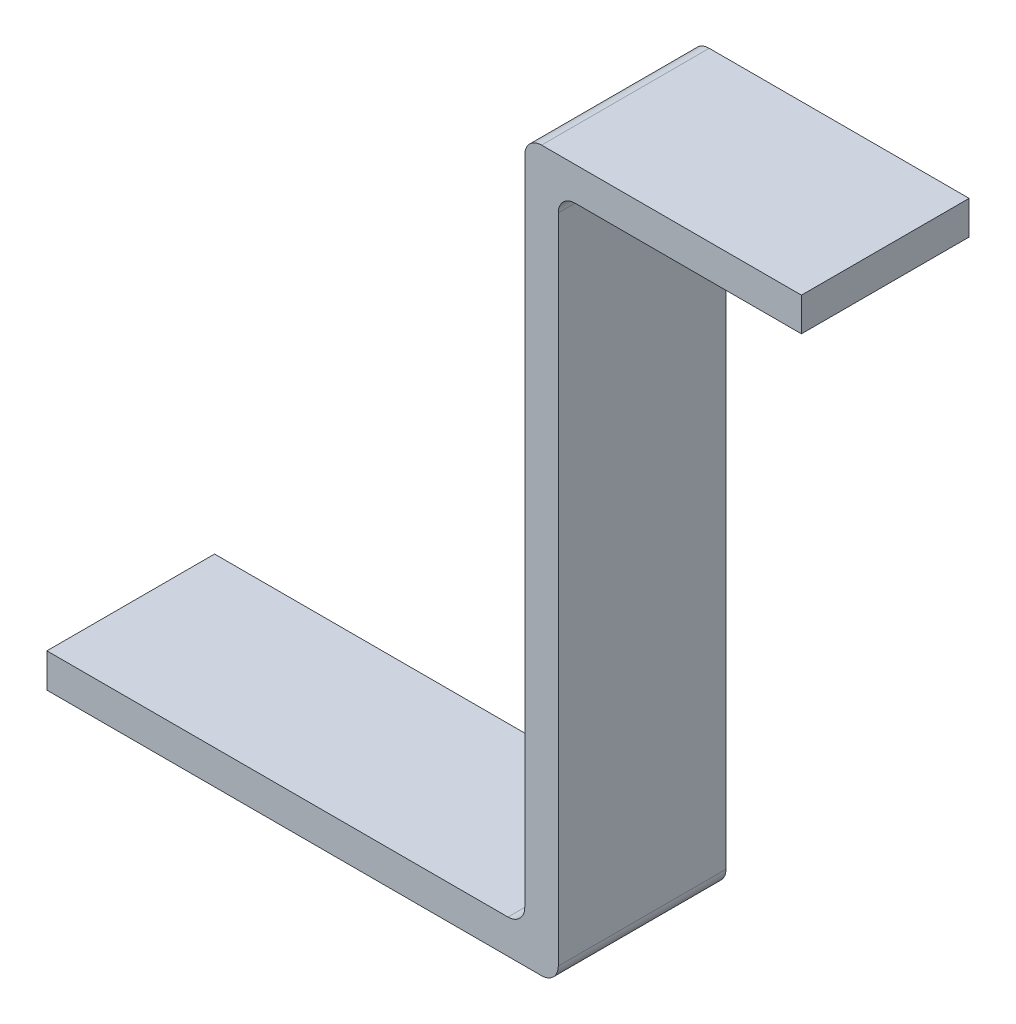
ISO-10303-21;
HEADER;
FILE_DESCRIPTION(('STEP AP214'),'2;1');
FILE_NAME('part.step','',(''),(''),'','','');
FILE_SCHEMA(('AUTOMOTIVE_DESIGN { 1 0 10303 214 1 1 1 1 }'));
ENDSEC;
DATA;
#1=APPLICATION_CONTEXT('core data for automotive mechanical design processes');
#2=APPLICATION_PROTOCOL_DEFINITION('international standard','automotive_design',2000,#1);
#3=PRODUCT_CONTEXT('',#1,'mechanical');
#4=PRODUCT('Part','Part','',(#3));
#5=PRODUCT_RELATED_PRODUCT_CATEGORY('part','',(#4));
#6=PRODUCT_DEFINITION_FORMATION('','',#4);
#7=PRODUCT_DEFINITION_CONTEXT('part definition',#1,'design');
#8=PRODUCT_DEFINITION('design','',#6,#7);
#9=PRODUCT_DEFINITION_SHAPE('','',#8);
#10=(LENGTH_UNIT() NAMED_UNIT(*) SI_UNIT(.MILLI.,.METRE.));
#11=(NAMED_UNIT(*) PLANE_ANGLE_UNIT() SI_UNIT($,.RADIAN.));
#12=(NAMED_UNIT(*) SI_UNIT($,.STERADIAN.) SOLID_ANGLE_UNIT());
#13=UNCERTAINTY_MEASURE_WITH_UNIT(LENGTH_MEASURE(1.E-05),#10,'distance_accuracy_value','');
#14=(GEOMETRIC_REPRESENTATION_CONTEXT(3) GLOBAL_UNCERTAINTY_ASSIGNED_CONTEXT((#13)) GLOBAL_UNIT_ASSIGNED_CONTEXT((#10,
#11,#12)) REPRESENTATION_CONTEXT('',''));
#15=CARTESIAN_POINT('',(0.,0.,0.));
#16=DIRECTION('',(0.,0.,1.));
#17=DIRECTION('',(1.,0.,0.));
#18=AXIS2_PLACEMENT_3D('',#15,#16,#17);
#19=CARTESIAN_POINT('',(0.,0.,25.4));
#20=DIRECTION('',(0.,0.,-1.));
#21=DIRECTION('',(-1.,0.,0.));
#22=AXIS2_PLACEMENT_3D('',#19,#20,#21);
#23=PLANE('',#22);
#24=CARTESIAN_POINT('',(17.78,73.66,25.4));
#25=DIRECTION('',(0.,0.,1.));
#26=DIRECTION('',(1.,0.,0.));
#27=AXIS2_PLACEMENT_3D('',#24,#25,#26);
#28=CIRCLE('',#27,2.54);
#29=CARTESIAN_POINT('',(17.78,76.2,25.4));
#30=VERTEX_POINT('',#29);
#31=CARTESIAN_POINT('',(15.24,73.66,25.4));
#32=VERTEX_POINT('',#31);
#33=EDGE_CURVE('E93',#30,#32,#28,.T.);
#34=ORIENTED_EDGE('',*,*,#33,.T.);
#35=DIRECTION('',(0.,1.,0.));
#36=VECTOR('',#35,1.);
#37=CARTESIAN_POINT('',(15.24,0.,25.4));
#38=LINE('',#37,#36);
#39=CARTESIAN_POINT('',(15.24,-25.0698,25.4));
#40=VERTEX_POINT('',#39);
#41=EDGE_CURVE('E186',#40,#32,#38,.T.);
#42=ORIENTED_EDGE('',*,*,#41,.F.);
#43=CARTESIAN_POINT('',(12.7,-25.0698,25.4));
#44=DIRECTION('',(0.,0.,1.));
#45=DIRECTION('',(1.,0.,0.));
#46=AXIS2_PLACEMENT_3D('',#43,#44,#45);
#47=CIRCLE('',#46,2.54);
#48=CARTESIAN_POINT('',(12.7,-27.6098,25.4));
#49=VERTEX_POINT('',#48);
#50=EDGE_CURVE('E248',#49,#40,#47,.T.);
#51=ORIENTED_EDGE('',*,*,#50,.F.);
#52=DIRECTION('',(1.,0.,0.));
#53=VECTOR('',#52,1.);
#54=CARTESIAN_POINT('',(0.,-27.6098,25.4));
#55=LINE('',#54,#53);
#56=CARTESIAN_POINT('',(-57.15,-27.6098,25.4));
#57=VERTEX_POINT('',#56);
#58=EDGE_CURVE('E251',#57,#49,#55,.T.);
#59=ORIENTED_EDGE('',*,*,#58,.F.);
#60=DIRECTION('',(0.,-1.,0.));
#61=VECTOR('',#60,1.);
#62=CARTESIAN_POINT('',(-57.15,76.2,25.4));
#63=LINE('',#62,#61);
#64=CARTESIAN_POINT('',(-57.15,-32.766,25.4));
#65=VERTEX_POINT('',#64);
#66=EDGE_CURVE('E190',#57,#65,#63,.T.);
#67=ORIENTED_EDGE('',*,*,#66,.T.);
#68=DIRECTION('',(-1.,0.,0.));
#69=VECTOR('',#68,1.);
#70=CARTESIAN_POINT('',(0.,-32.766,25.4));
#71=LINE('',#70,#69);
#72=CARTESIAN_POINT('',(17.78,-32.766,25.4));
#73=VERTEX_POINT('',#72);
#74=EDGE_CURVE('E218',#73,#65,#71,.T.);
#75=ORIENTED_EDGE('',*,*,#74,.F.);
#76=CARTESIAN_POINT('',(17.78,-30.226,25.4));
#77=DIRECTION('',(0.,0.,1.));
#78=DIRECTION('',(1.,0.,0.));
#79=AXIS2_PLACEMENT_3D('',#76,#77,#78);
#80=CIRCLE('',#79,2.54);
#81=CARTESIAN_POINT('',(20.32,-30.226,25.4));
#82=VERTEX_POINT('',#81);
#83=EDGE_CURVE('E221',#73,#82,#80,.T.);
#84=ORIENTED_EDGE('',*,*,#83,.T.);
#85=DIRECTION('',(0.,-1.,0.));
#86=VECTOR('',#85,1.);
#87=CARTESIAN_POINT('',(20.32,0.,25.4));
#88=LINE('',#87,#86);
#89=CARTESIAN_POINT('',(20.32,68.58,25.4));
#90=VERTEX_POINT('',#89);
#91=EDGE_CURVE('E224',#90,#82,#88,.T.);
#92=ORIENTED_EDGE('',*,*,#91,.F.);
#93=CARTESIAN_POINT('',(22.86,68.58,25.4));
#94=DIRECTION('',(0.,0.,1.));
#95=DIRECTION('',(1.,0.,0.));
#96=AXIS2_PLACEMENT_3D('',#93,#94,#95);
#97=CIRCLE('',#96,2.54);
#98=CARTESIAN_POINT('',(22.86,71.12,25.4));
#99=VERTEX_POINT('',#98);
#100=EDGE_CURVE('E226',#90,#99,#97,.F.);
#101=ORIENTED_EDGE('',*,*,#100,.T.);
#102=DIRECTION('',(1.,0.,0.));
#103=VECTOR('',#102,1.);
#104=CARTESIAN_POINT('',(0.,71.12,25.4));
#105=LINE('',#104,#103);
#106=CARTESIAN_POINT('',(57.15,71.12,25.4));
#107=VERTEX_POINT('',#106);
#108=EDGE_CURVE('E214',#99,#107,#105,.T.);
#109=ORIENTED_EDGE('',*,*,#108,.T.);
#110=DIRECTION('',(0.,1.,0.));
#111=VECTOR('',#110,1.);
#112=CARTESIAN_POINT('',(57.15,76.2,25.4));
#113=LINE('',#112,#111);
#114=CARTESIAN_POINT('',(57.15,76.2,25.4));
#115=VERTEX_POINT('',#114);
#116=EDGE_CURVE('E192',#107,#115,#113,.T.);
#117=ORIENTED_EDGE('',*,*,#116,.T.);
#118=DIRECTION('',(-1.,0.,0.));
#119=VECTOR('',#118,1.);
#120=CARTESIAN_POINT('',(57.15,76.2,25.4));
#121=LINE('',#120,#119);
#122=EDGE_CURVE('E86',#115,#30,#121,.T.);
#123=ORIENTED_EDGE('',*,*,#122,.T.);
#124=EDGE_LOOP('',(#34,#42,#51,#59,#67,#75,#84,#92,#101,#109,#117,#123));
#125=FACE_BOUND('',#124,.T.);
#126=ADVANCED_FACE('F78',(#125),#23,.F.);
#127=CARTESIAN_POINT('',(0.,0.,0.));
#128=DIRECTION('',(0.,0.,-1.));
#129=DIRECTION('',(-1.,0.,0.));
#130=AXIS2_PLACEMENT_3D('',#127,#128,#129);
#131=PLANE('',#130);
#132=DIRECTION('',(0.,1.,0.));
#133=VECTOR('',#132,1.);
#134=CARTESIAN_POINT('',(15.24,0.,0.));
#135=LINE('',#134,#133);
#136=CARTESIAN_POINT('',(15.24,-25.0698,0.));
#137=VERTEX_POINT('',#136);
#138=CARTESIAN_POINT('',(15.24,73.66,0.));
#139=VERTEX_POINT('',#138);
#140=EDGE_CURVE('E175',#137,#139,#135,.T.);
#141=ORIENTED_EDGE('',*,*,#140,.T.);
#142=CARTESIAN_POINT('',(17.78,73.66,0.));
#143=DIRECTION('',(0.,0.,1.));
#144=DIRECTION('',(1.,0.,0.));
#145=AXIS2_PLACEMENT_3D('',#142,#143,#144);
#146=CIRCLE('',#145,2.54);
#147=CARTESIAN_POINT('',(17.78,76.2,0.));
#148=VERTEX_POINT('',#147);
#149=EDGE_CURVE('E168',#148,#139,#146,.T.);
#150=ORIENTED_EDGE('',*,*,#149,.F.);
#151=DIRECTION('',(-1.,0.,0.));
#152=VECTOR('',#151,1.);
#153=CARTESIAN_POINT('',(57.15,76.2,0.));
#154=LINE('',#153,#152);
#155=CARTESIAN_POINT('',(57.15,76.2,0.));
#156=VERTEX_POINT('',#155);
#157=EDGE_CURVE('E182',#156,#148,#154,.T.);
#158=ORIENTED_EDGE('',*,*,#157,.F.);
#159=DIRECTION('',(0.,1.,0.));
#160=VECTOR('',#159,1.);
#161=CARTESIAN_POINT('',(57.15,76.2,0.));
#162=LINE('',#161,#160);
#163=CARTESIAN_POINT('',(57.15,71.12,0.));
#164=VERTEX_POINT('',#163);
#165=EDGE_CURVE('E191',#164,#156,#162,.T.);
#166=ORIENTED_EDGE('',*,*,#165,.F.);
#167=DIRECTION('',(1.,0.,0.));
#168=VECTOR('',#167,1.);
#169=CARTESIAN_POINT('',(0.,71.12,0.));
#170=LINE('',#169,#168);
#171=CARTESIAN_POINT('',(22.86,71.12,0.));
#172=VERTEX_POINT('',#171);
#173=EDGE_CURVE('E203',#172,#164,#170,.T.);
#174=ORIENTED_EDGE('',*,*,#173,.F.);
#175=CARTESIAN_POINT('',(22.86,68.58,0.));
#176=DIRECTION('',(0.,0.,1.));
#177=DIRECTION('',(1.,0.,0.));
#178=AXIS2_PLACEMENT_3D('',#175,#176,#177);
#179=CIRCLE('',#178,2.54);
#180=CARTESIAN_POINT('',(20.32,68.58,0.));
#181=VERTEX_POINT('',#180);
#182=EDGE_CURVE('E217',#181,#172,#179,.F.);
#183=ORIENTED_EDGE('',*,*,#182,.F.);
#184=DIRECTION('',(0.,-1.,0.));
#185=VECTOR('',#184,1.);
#186=CARTESIAN_POINT('',(20.32,0.,0.));
#187=LINE('',#186,#185);
#188=CARTESIAN_POINT('',(20.32,-30.226,0.));
#189=VERTEX_POINT('',#188);
#190=EDGE_CURVE('E236',#181,#189,#187,.T.);
#191=ORIENTED_EDGE('',*,*,#190,.T.);
#192=CARTESIAN_POINT('',(17.78,-30.226,0.));
#193=DIRECTION('',(0.,0.,1.));
#194=DIRECTION('',(1.,0.,0.));
#195=AXIS2_PLACEMENT_3D('',#192,#193,#194);
#196=CIRCLE('',#195,2.54);
#197=CARTESIAN_POINT('',(17.78,-32.766,0.));
#198=VERTEX_POINT('',#197);
#199=EDGE_CURVE('E234',#198,#189,#196,.T.);
#200=ORIENTED_EDGE('',*,*,#199,.F.);
#201=DIRECTION('',(-1.,0.,0.));
#202=VECTOR('',#201,1.);
#203=CARTESIAN_POINT('',(0.,-32.766,0.));
#204=LINE('',#203,#202);
#205=CARTESIAN_POINT('',(-57.15,-32.766,0.));
#206=VERTEX_POINT('',#205);
#207=EDGE_CURVE('E231',#198,#206,#204,.T.);
#208=ORIENTED_EDGE('',*,*,#207,.T.);
#209=DIRECTION('',(0.,-1.,0.));
#210=VECTOR('',#209,1.);
#211=CARTESIAN_POINT('',(-57.15,76.2,0.));
#212=LINE('',#211,#210);
#213=CARTESIAN_POINT('',(-57.15,-27.6098,0.));
#214=VERTEX_POINT('',#213);
#215=EDGE_CURVE('E194',#214,#206,#212,.T.);
#216=ORIENTED_EDGE('',*,*,#215,.F.);
#217=DIRECTION('',(1.,0.,0.));
#218=VECTOR('',#217,1.);
#219=CARTESIAN_POINT('',(0.,-27.6098,0.));
#220=LINE('',#219,#218);
#221=CARTESIAN_POINT('',(12.7,-27.6098,0.));
#222=VERTEX_POINT('',#221);
#223=EDGE_CURVE('E185',#214,#222,#220,.T.);
#224=ORIENTED_EDGE('',*,*,#223,.T.);
#225=CARTESIAN_POINT('',(12.7,-25.0698,0.));
#226=DIRECTION('',(0.,0.,1.));
#227=DIRECTION('',(1.,0.,0.));
#228=AXIS2_PLACEMENT_3D('',#225,#226,#227);
#229=CIRCLE('',#228,2.54);
#230=EDGE_CURVE('E256',#222,#137,#229,.T.);
#231=ORIENTED_EDGE('',*,*,#230,.T.);
#232=EDGE_LOOP('',(#141,#150,#158,#166,#174,#183,#191,#200,#208,#216,#224,#231));
#233=FACE_BOUND('',#232,.T.);
#234=ADVANCED_FACE('F180',(#233),#131,.T.);
#235=CARTESIAN_POINT('',(57.15,76.2,25.4));
#236=DIRECTION('',(-1.,0.,0.));
#237=DIRECTION('',(0.,-1.,0.));
#238=AXIS2_PLACEMENT_3D('',#235,#236,#237);
#239=PLANE('',#238);
#240=DIRECTION('',(0.,0.,1.));
#241=VECTOR('',#240,1.);
#242=CARTESIAN_POINT('',(57.15,71.12,0.));
#243=LINE('',#242,#241);
#244=EDGE_CURVE('E210',#164,#107,#243,.T.);
#245=ORIENTED_EDGE('',*,*,#244,.F.);
#246=ORIENTED_EDGE('',*,*,#165,.T.);
#247=DIRECTION('',(0.,0.,-1.));
#248=VECTOR('',#247,1.);
#249=CARTESIAN_POINT('',(57.15,76.2,25.4));
#250=LINE('',#249,#248);
#251=EDGE_CURVE('E12',#115,#156,#250,.T.);
#252=ORIENTED_EDGE('',*,*,#251,.F.);
#253=ORIENTED_EDGE('',*,*,#116,.F.);
#254=EDGE_LOOP('',(#245,#246,#252,#253));
#255=FACE_BOUND('',#254,.T.);
#256=ADVANCED_FACE('F290',(#255),#239,.F.);
#257=CARTESIAN_POINT('',(-57.15,76.2,25.4));
#258=DIRECTION('',(1.,0.,0.));
#259=DIRECTION('',(0.,1.,0.));
#260=AXIS2_PLACEMENT_3D('',#257,#258,#259);
#261=PLANE('',#260);
#262=ORIENTED_EDGE('',*,*,#66,.F.);
#263=DIRECTION('',(0.,0.,1.));
#264=VECTOR('',#263,1.);
#265=CARTESIAN_POINT('',(-57.15,-27.6098,0.));
#266=LINE('',#265,#264);
#267=EDGE_CURVE('E174',#214,#57,#266,.T.);
#268=ORIENTED_EDGE('',*,*,#267,.F.);
#269=ORIENTED_EDGE('',*,*,#215,.T.);
#270=DIRECTION('',(0.,0.,1.));
#271=VECTOR('',#270,1.);
#272=CARTESIAN_POINT('',(-57.15,-32.766,0.));
#273=LINE('',#272,#271);
#274=EDGE_CURVE('E207',#206,#65,#273,.T.);
#275=ORIENTED_EDGE('',*,*,#274,.T.);
#276=EDGE_LOOP('',(#262,#268,#269,#275));
#277=FACE_BOUND('',#276,.T.);
#278=ADVANCED_FACE('F80',(#277),#261,.F.);
#279=CARTESIAN_POINT('',(57.15,76.2,25.4));
#280=DIRECTION('',(0.,-1.,0.));
#281=DIRECTION('',(0.,0.,-1.));
#282=AXIS2_PLACEMENT_3D('',#279,#280,#281);
#283=PLANE('',#282);
#284=ORIENTED_EDGE('',*,*,#157,.T.);
#285=DIRECTION('',(0.,0.,1.));
#286=VECTOR('',#285,1.);
#287=CARTESIAN_POINT('',(17.78,76.2,0.));
#288=LINE('',#287,#286);
#289=EDGE_CURVE('E165',#148,#30,#288,.T.);
#290=ORIENTED_EDGE('',*,*,#289,.T.);
#291=ORIENTED_EDGE('',*,*,#122,.F.);
#292=ORIENTED_EDGE('',*,*,#251,.T.);
#293=EDGE_LOOP('',(#284,#290,#291,#292));
#294=FACE_BOUND('',#293,.T.);
#295=ADVANCED_FACE('F188',(#294),#283,.F.);
#296=CARTESIAN_POINT('',(22.86,68.58,0.));
#297=DIRECTION('',(0.,0.,1.));
#298=DIRECTION('',(1.,0.,0.));
#299=AXIS2_PLACEMENT_3D('',#296,#297,#298);
#300=CYLINDRICAL_SURFACE('',#299,2.54);
#301=ORIENTED_EDGE('',*,*,#100,.F.);
#302=DIRECTION('',(0.,0.,1.));
#303=VECTOR('',#302,1.);
#304=CARTESIAN_POINT('',(20.32,68.58,0.));
#305=LINE('',#304,#303);
#306=EDGE_CURVE('E201',#181,#90,#305,.T.);
#307=ORIENTED_EDGE('',*,*,#306,.F.);
#308=ORIENTED_EDGE('',*,*,#182,.T.);
#309=DIRECTION('',(0.,0.,1.));
#310=VECTOR('',#309,1.);
#311=CARTESIAN_POINT('',(22.86,71.12,0.));
#312=LINE('',#311,#310);
#313=EDGE_CURVE('E198',#172,#99,#312,.T.);
#314=ORIENTED_EDGE('',*,*,#313,.T.);
#315=EDGE_LOOP('',(#301,#307,#308,#314));
#316=FACE_BOUND('',#315,.T.);
#317=ADVANCED_FACE('F283',(#316),#300,.F.);
#318=CARTESIAN_POINT('',(0.,71.12,0.));
#319=DIRECTION('',(0.,-1.,0.));
#320=DIRECTION('',(0.,0.,-1.));
#321=AXIS2_PLACEMENT_3D('',#318,#319,#320);
#322=PLANE('',#321);
#323=ORIENTED_EDGE('',*,*,#108,.F.);
#324=ORIENTED_EDGE('',*,*,#313,.F.);
#325=ORIENTED_EDGE('',*,*,#173,.T.);
#326=ORIENTED_EDGE('',*,*,#244,.T.);
#327=EDGE_LOOP('',(#323,#324,#325,#326));
#328=FACE_BOUND('',#327,.T.);
#329=ADVANCED_FACE('F287',(#328),#322,.T.);
#330=CARTESIAN_POINT('',(0.,-32.766,0.));
#331=DIRECTION('',(0.,1.,0.));
#332=DIRECTION('',(-1.,0.,0.));
#333=AXIS2_PLACEMENT_3D('',#330,#331,#332);
#334=PLANE('',#333);
#335=ORIENTED_EDGE('',*,*,#74,.T.);
#336=ORIENTED_EDGE('',*,*,#274,.F.);
#337=ORIENTED_EDGE('',*,*,#207,.F.);
#338=DIRECTION('',(0.,0.,1.));
#339=VECTOR('',#338,1.);
#340=CARTESIAN_POINT('',(17.78,-32.766,0.));
#341=LINE('',#340,#339);
#342=EDGE_CURVE('E205',#198,#73,#341,.T.);
#343=ORIENTED_EDGE('',*,*,#342,.T.);
#344=EDGE_LOOP('',(#335,#336,#337,#343));
#345=FACE_BOUND('',#344,.T.);
#346=ADVANCED_FACE('F272',(#345),#334,.F.);
#347=CARTESIAN_POINT('',(17.78,-30.226,0.));
#348=DIRECTION('',(0.,0.,1.));
#349=DIRECTION('',(1.,0.,0.));
#350=AXIS2_PLACEMENT_3D('',#347,#348,#349);
#351=CYLINDRICAL_SURFACE('',#350,2.54);
#352=ORIENTED_EDGE('',*,*,#83,.F.);
#353=ORIENTED_EDGE('',*,*,#342,.F.);
#354=ORIENTED_EDGE('',*,*,#199,.T.);
#355=DIRECTION('',(0.,0.,1.));
#356=VECTOR('',#355,1.);
#357=CARTESIAN_POINT('',(20.32,-30.226,0.));
#358=LINE('',#357,#356);
#359=EDGE_CURVE('E101',#189,#82,#358,.T.);
#360=ORIENTED_EDGE('',*,*,#359,.T.);
#361=EDGE_LOOP('',(#352,#353,#354,#360));
#362=FACE_BOUND('',#361,.T.);
#363=ADVANCED_FACE('F277',(#362),#351,.T.);
#364=CARTESIAN_POINT('',(20.32,0.,0.));
#365=DIRECTION('',(-1.,0.,0.));
#366=DIRECTION('',(0.,-1.,0.));
#367=AXIS2_PLACEMENT_3D('',#364,#365,#366);
#368=PLANE('',#367);
#369=ORIENTED_EDGE('',*,*,#91,.T.);
#370=ORIENTED_EDGE('',*,*,#359,.F.);
#371=ORIENTED_EDGE('',*,*,#190,.F.);
#372=ORIENTED_EDGE('',*,*,#306,.T.);
#373=EDGE_LOOP('',(#369,#370,#371,#372));
#374=FACE_BOUND('',#373,.T.);
#375=ADVANCED_FACE('F280',(#374),#368,.F.);
#376=CARTESIAN_POINT('',(17.78,73.66,0.));
#377=DIRECTION('',(0.,0.,1.));
#378=DIRECTION('',(1.,0.,0.));
#379=AXIS2_PLACEMENT_3D('',#376,#377,#378);
#380=CYLINDRICAL_SURFACE('',#379,2.54);
#381=ORIENTED_EDGE('',*,*,#33,.F.);
#382=ORIENTED_EDGE('',*,*,#289,.F.);
#383=ORIENTED_EDGE('',*,*,#149,.T.);
#384=DIRECTION('',(0.,0.,1.));
#385=VECTOR('',#384,1.);
#386=CARTESIAN_POINT('',(15.24,73.66,0.));
#387=LINE('',#386,#385);
#388=EDGE_CURVE('E229',#139,#32,#387,.T.);
#389=ORIENTED_EDGE('',*,*,#388,.T.);
#390=EDGE_LOOP('',(#381,#382,#383,#389));
#391=FACE_BOUND('',#390,.T.);
#392=ADVANCED_FACE('F167',(#391),#380,.T.);
#393=CARTESIAN_POINT('',(15.24,0.,0.));
#394=DIRECTION('',(1.,0.,0.));
#395=DIRECTION('',(0.,0.,-1.));
#396=AXIS2_PLACEMENT_3D('',#393,#394,#395);
#397=PLANE('',#396);
#398=ORIENTED_EDGE('',*,*,#41,.T.);
#399=ORIENTED_EDGE('',*,*,#388,.F.);
#400=ORIENTED_EDGE('',*,*,#140,.F.);
#401=DIRECTION('',(0.,0.,1.));
#402=VECTOR('',#401,1.);
#403=CARTESIAN_POINT('',(15.24,-25.0698,0.));
#404=LINE('',#403,#402);
#405=EDGE_CURVE('E243',#137,#40,#404,.T.);
#406=ORIENTED_EDGE('',*,*,#405,.T.);
#407=EDGE_LOOP('',(#398,#399,#400,#406));
#408=FACE_BOUND('',#407,.T.);
#409=ADVANCED_FACE('F294',(#408),#397,.F.);
#410=CARTESIAN_POINT('',(12.7,-25.0698,0.));
#411=DIRECTION('',(0.,0.,1.));
#412=DIRECTION('',(1.,0.,0.));
#413=AXIS2_PLACEMENT_3D('',#410,#411,#412);
#414=CYLINDRICAL_SURFACE('',#413,2.54);
#415=ORIENTED_EDGE('',*,*,#50,.T.);
#416=ORIENTED_EDGE('',*,*,#405,.F.);
#417=ORIENTED_EDGE('',*,*,#230,.F.);
#418=DIRECTION('',(0.,0.,1.));
#419=VECTOR('',#418,1.);
#420=CARTESIAN_POINT('',(12.7,-27.6098,0.));
#421=LINE('',#420,#419);
#422=EDGE_CURVE('E241',#222,#49,#421,.T.);
#423=ORIENTED_EDGE('',*,*,#422,.T.);
#424=EDGE_LOOP('',(#415,#416,#417,#423));
#425=FACE_BOUND('',#424,.T.);
#426=ADVANCED_FACE('F296',(#425),#414,.F.);
#427=CARTESIAN_POINT('',(0.,-27.6098,0.));
#428=DIRECTION('',(0.,-1.,0.));
#429=DIRECTION('',(0.,0.,-1.));
#430=AXIS2_PLACEMENT_3D('',#427,#428,#429);
#431=PLANE('',#430);
#432=ORIENTED_EDGE('',*,*,#58,.T.);
#433=ORIENTED_EDGE('',*,*,#422,.F.);
#434=ORIENTED_EDGE('',*,*,#223,.F.);
#435=ORIENTED_EDGE('',*,*,#267,.T.);
#436=EDGE_LOOP('',(#432,#433,#434,#435));
#437=FACE_BOUND('',#436,.T.);
#438=ADVANCED_FACE('F263',(#437),#431,.F.);
#439=CLOSED_SHELL('',(#126,#234,#256,#278,#295,#317,#329,#346,#363,#375,#392,#409,#426,#438));
#440=MANIFOLD_SOLID_BREP('B2',#439);
#441=ADVANCED_BREP_SHAPE_REPRESENTATION('',(#18,#440),#14);
#442=SHAPE_DEFINITION_REPRESENTATION(#9,#441);
ENDSEC;
END-ISO-10303-21;
